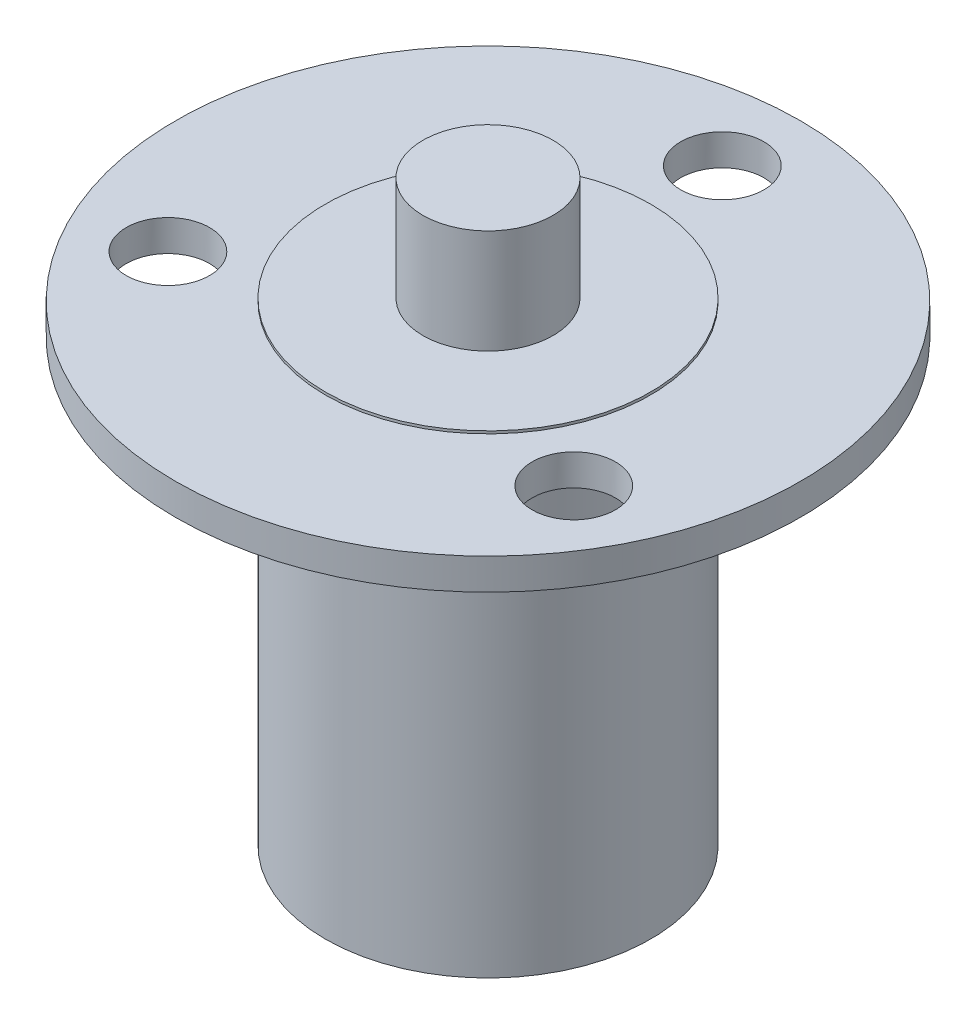
ISO-10303-21;
HEADER;
FILE_DESCRIPTION(('STEP AP214'),'2;1');
FILE_NAME('part.step','',(''),(''),'','','');
FILE_SCHEMA(('AUTOMOTIVE_DESIGN { 1 0 10303 214 1 1 1 1 }'));
ENDSEC;
DATA;
#1=APPLICATION_CONTEXT('core data for automotive mechanical design processes');
#2=APPLICATION_PROTOCOL_DEFINITION('international standard','automotive_design',2000,#1);
#3=PRODUCT_CONTEXT('',#1,'mechanical');
#4=PRODUCT('Part','Part','',(#3));
#5=PRODUCT_RELATED_PRODUCT_CATEGORY('part','',(#4));
#6=PRODUCT_DEFINITION_FORMATION('','',#4);
#7=PRODUCT_DEFINITION_CONTEXT('part definition',#1,'design');
#8=PRODUCT_DEFINITION('design','',#6,#7);
#9=PRODUCT_DEFINITION_SHAPE('','',#8);
#10=(LENGTH_UNIT() NAMED_UNIT(*) SI_UNIT(.MILLI.,.METRE.));
#11=(NAMED_UNIT(*) PLANE_ANGLE_UNIT() SI_UNIT($,.RADIAN.));
#12=(NAMED_UNIT(*) SI_UNIT($,.STERADIAN.) SOLID_ANGLE_UNIT());
#13=UNCERTAINTY_MEASURE_WITH_UNIT(LENGTH_MEASURE(1.E-05),#10,'distance_accuracy_value','');
#14=(GEOMETRIC_REPRESENTATION_CONTEXT(3) GLOBAL_UNCERTAINTY_ASSIGNED_CONTEXT((#13)) GLOBAL_UNIT_ASSIGNED_CONTEXT((#10,
#11,#12)) REPRESENTATION_CONTEXT('',''));
#15=CARTESIAN_POINT('',(0.,0.,0.));
#16=DIRECTION('',(0.,0.,1.));
#17=DIRECTION('',(1.,0.,0.));
#18=AXIS2_PLACEMENT_3D('',#15,#16,#17);
#19=CARTESIAN_POINT('',(0.,18.1,0.));
#20=DIRECTION('',(0.,-1.,0.));
#21=DIRECTION('',(0.,0.,-1.));
#22=AXIS2_PLACEMENT_3D('',#19,#20,#21);
#23=CYLINDRICAL_SURFACE('',#22,12.);
#24=CARTESIAN_POINT('',(0.,18.1,0.));
#25=DIRECTION('',(0.,-1.,0.));
#26=DIRECTION('',(0.,0.,-1.));
#27=AXIS2_PLACEMENT_3D('',#24,#25,#26);
#28=CIRCLE('',#27,12.);
#29=CARTESIAN_POINT('',(0.,18.1,-12.));
#30=VERTEX_POINT('',#29);
#31=EDGE_CURVE('E58',#30,#30,#28,.T.);
#32=ORIENTED_EDGE('',*,*,#31,.T.);
#33=EDGE_LOOP('',(#32));
#34=FACE_BOUND('',#33,.T.);
#35=CARTESIAN_POINT('',(0.,16.9,0.));
#36=DIRECTION('',(0.,-1.,0.));
#37=DIRECTION('',(0.,0.,-1.));
#38=AXIS2_PLACEMENT_3D('',#35,#36,#37);
#39=CIRCLE('',#38,12.);
#40=CARTESIAN_POINT('',(0.,16.9,-12.));
#41=VERTEX_POINT('',#40);
#42=EDGE_CURVE('E55',#41,#41,#39,.T.);
#43=ORIENTED_EDGE('',*,*,#42,.F.);
#44=EDGE_LOOP('',(#43));
#45=FACE_BOUND('',#44,.T.);
#46=ADVANCED_FACE('F31',(#34,#45),#23,.T.);
#47=CARTESIAN_POINT('',(12.,18.1,0.));
#48=DIRECTION('',(0.,1.,0.));
#49=DIRECTION('',(0.,0.,1.));
#50=AXIS2_PLACEMENT_3D('',#47,#48,#49);
#51=PLANE('',#50);
#52=CARTESIAN_POINT('',(-7.79422863405883,18.1,4.50000000000065));
#53=DIRECTION('',(0.,1.,0.));
#54=DIRECTION('',(0.,0.,1.));
#55=AXIS2_PLACEMENT_3D('',#52,#53,#54);
#56=CIRCLE('',#55,1.59999999999999);
#57=CARTESIAN_POINT('',(-7.79422863405883,18.1,6.10000000000063));
#58=VERTEX_POINT('',#57);
#59=EDGE_CURVE('E79',#58,#58,#56,.T.);
#60=ORIENTED_EDGE('',*,*,#59,.F.);
#61=EDGE_LOOP('',(#60));
#62=FACE_BOUND('',#61,.T.);
#63=CARTESIAN_POINT('',(7.79422863406107,18.1,4.49999999999935));
#64=DIRECTION('',(0.,1.,0.));
#65=DIRECTION('',(0.,0.,1.));
#66=AXIS2_PLACEMENT_3D('',#63,#64,#65);
#67=CIRCLE('',#66,1.59999999999999);
#68=CARTESIAN_POINT('',(7.79422863406107,18.1,6.09999999999934));
#69=VERTEX_POINT('',#68);
#70=EDGE_CURVE('E72',#69,#69,#67,.T.);
#71=ORIENTED_EDGE('',*,*,#70,.F.);
#72=EDGE_LOOP('',(#71));
#73=FACE_BOUND('',#72,.T.);
#74=CARTESIAN_POINT('',(0.,18.1,-9.));
#75=DIRECTION('',(0.,1.,0.));
#76=DIRECTION('',(0.,0.,1.));
#77=AXIS2_PLACEMENT_3D('',#74,#75,#76);
#78=CIRCLE('',#77,1.59999999999999);
#79=CARTESIAN_POINT('',(0.,18.1,-7.40000000000001));
#80=VERTEX_POINT('',#79);
#81=EDGE_CURVE('E64',#80,#80,#78,.T.);
#82=ORIENTED_EDGE('',*,*,#81,.F.);
#83=EDGE_LOOP('',(#82));
#84=FACE_BOUND('',#83,.T.);
#85=CARTESIAN_POINT('',(0.,18.1,0.));
#86=DIRECTION('',(0.,1.,0.));
#87=DIRECTION('',(0.,0.,1.));
#88=AXIS2_PLACEMENT_3D('',#85,#86,#87);
#89=CIRCLE('',#88,6.25);
#90=CARTESIAN_POINT('',(0.,18.1,6.25));
#91=VERTEX_POINT('',#90);
#92=EDGE_CURVE('E43',#91,#91,#89,.T.);
#93=ORIENTED_EDGE('',*,*,#92,.F.);
#94=EDGE_LOOP('',(#93));
#95=FACE_BOUND('',#94,.T.);
#96=ORIENTED_EDGE('',*,*,#31,.F.);
#97=EDGE_LOOP('',(#96));
#98=FACE_BOUND('',#97,.T.);
#99=ADVANCED_FACE('F85',(#62,#73,#84,#95,#98),#51,.T.);
#100=CARTESIAN_POINT('',(0.,16.9,0.));
#101=DIRECTION('',(0.,-1.,0.));
#102=DIRECTION('',(0.,0.,-1.));
#103=AXIS2_PLACEMENT_3D('',#100,#101,#102);
#104=PLANE('',#103);
#105=CARTESIAN_POINT('',(-7.79422863405883,16.9,4.50000000000065));
#106=DIRECTION('',(0.,-1.,0.));
#107=DIRECTION('',(0.,0.,-1.));
#108=AXIS2_PLACEMENT_3D('',#105,#106,#107);
#109=CIRCLE('',#108,1.59999999999998);
#110=CARTESIAN_POINT('',(-7.79422863405883,16.9,2.90000000000066));
#111=VERTEX_POINT('',#110);
#112=EDGE_CURVE('E76',#111,#111,#109,.T.);
#113=ORIENTED_EDGE('',*,*,#112,.F.);
#114=EDGE_LOOP('',(#113));
#115=FACE_BOUND('',#114,.T.);
#116=CARTESIAN_POINT('',(7.79422863406107,16.9,4.49999999999935));
#117=DIRECTION('',(0.,-1.,0.));
#118=DIRECTION('',(0.,0.,-1.));
#119=AXIS2_PLACEMENT_3D('',#116,#117,#118);
#120=CIRCLE('',#119,1.59999999999998);
#121=CARTESIAN_POINT('',(7.79422863406107,16.9,2.89999999999937));
#122=VERTEX_POINT('',#121);
#123=EDGE_CURVE('E34',#122,#122,#120,.T.);
#124=ORIENTED_EDGE('',*,*,#123,.F.);
#125=EDGE_LOOP('',(#124));
#126=FACE_BOUND('',#125,.T.);
#127=CARTESIAN_POINT('',(0.,16.9,-9.));
#128=DIRECTION('',(0.,-1.,0.));
#129=DIRECTION('',(0.,0.,-1.));
#130=AXIS2_PLACEMENT_3D('',#127,#128,#129);
#131=CIRCLE('',#130,1.59999999999998);
#132=CARTESIAN_POINT('',(0.,16.9,-10.6));
#133=VERTEX_POINT('',#132);
#134=EDGE_CURVE('E62',#133,#133,#131,.T.);
#135=ORIENTED_EDGE('',*,*,#134,.F.);
#136=EDGE_LOOP('',(#135));
#137=FACE_BOUND('',#136,.T.);
#138=CARTESIAN_POINT('',(0.,16.9,0.));
#139=DIRECTION('',(0.,-1.,0.));
#140=DIRECTION('',(0.,0.,-1.));
#141=AXIS2_PLACEMENT_3D('',#138,#139,#140);
#142=CIRCLE('',#141,6.25);
#143=CARTESIAN_POINT('',(0.,16.9,-6.25));
#144=VERTEX_POINT('',#143);
#145=EDGE_CURVE('E10',#144,#144,#142,.T.);
#146=ORIENTED_EDGE('',*,*,#145,.F.);
#147=EDGE_LOOP('',(#146));
#148=FACE_BOUND('',#147,.T.);
#149=ORIENTED_EDGE('',*,*,#42,.T.);
#150=EDGE_LOOP('',(#149));
#151=FACE_BOUND('',#150,.T.);
#152=ADVANCED_FACE('F88',(#115,#126,#137,#148,#151),#104,.T.);
#153=CARTESIAN_POINT('',(0.,18.2,0.));
#154=DIRECTION('',(0.,-1.,0.));
#155=DIRECTION('',(0.,0.,-1.));
#156=AXIS2_PLACEMENT_3D('',#153,#154,#155);
#157=CYLINDRICAL_SURFACE('',#156,6.25);
#158=CARTESIAN_POINT('',(0.,18.2,0.));
#159=DIRECTION('',(0.,1.,0.));
#160=DIRECTION('',(0.,0.,1.));
#161=AXIS2_PLACEMENT_3D('',#158,#159,#160);
#162=CIRCLE('',#161,6.25);
#163=CARTESIAN_POINT('',(0.,18.2,6.25));
#164=VERTEX_POINT('',#163);
#165=EDGE_CURVE('E51',#164,#164,#162,.T.);
#166=ORIENTED_EDGE('',*,*,#165,.F.);
#167=EDGE_LOOP('',(#166));
#168=FACE_BOUND('',#167,.T.);
#169=ORIENTED_EDGE('',*,*,#92,.T.);
#170=EDGE_LOOP('',(#169));
#171=FACE_BOUND('',#170,.T.);
#172=ADVANCED_FACE('F101',(#168,#171),#157,.T.);
#173=CARTESIAN_POINT('',(0.,18.2,0.));
#174=DIRECTION('',(0.,1.,0.));
#175=DIRECTION('',(0.,0.,1.));
#176=AXIS2_PLACEMENT_3D('',#173,#174,#175);
#177=PLANE('',#176);
#178=CARTESIAN_POINT('',(0.,18.2,0.));
#179=DIRECTION('',(0.,1.,0.));
#180=DIRECTION('',(0.,0.,1.));
#181=AXIS2_PLACEMENT_3D('',#178,#179,#180);
#182=CIRCLE('',#181,2.5);
#183=CARTESIAN_POINT('',(0.,18.2,2.5));
#184=VERTEX_POINT('',#183);
#185=EDGE_CURVE('E38',#184,#184,#182,.T.);
#186=ORIENTED_EDGE('',*,*,#185,.F.);
#187=EDGE_LOOP('',(#186));
#188=FACE_BOUND('',#187,.T.);
#189=ORIENTED_EDGE('',*,*,#165,.T.);
#190=EDGE_LOOP('',(#189));
#191=FACE_BOUND('',#190,.T.);
#192=ADVANCED_FACE('F107',(#188,#191),#177,.T.);
#193=CARTESIAN_POINT('',(0.,22.2,0.));
#194=DIRECTION('',(0.,-1.,0.));
#195=DIRECTION('',(0.,0.,-1.));
#196=AXIS2_PLACEMENT_3D('',#193,#194,#195);
#197=CYLINDRICAL_SURFACE('',#196,2.5);
#198=CARTESIAN_POINT('',(0.,22.2,0.));
#199=DIRECTION('',(0.,1.,0.));
#200=DIRECTION('',(0.,0.,1.));
#201=AXIS2_PLACEMENT_3D('',#198,#199,#200);
#202=CIRCLE('',#201,2.5);
#203=CARTESIAN_POINT('',(0.,22.2,2.5));
#204=VERTEX_POINT('',#203);
#205=EDGE_CURVE('E49',#204,#204,#202,.T.);
#206=ORIENTED_EDGE('',*,*,#205,.F.);
#207=EDGE_LOOP('',(#206));
#208=FACE_BOUND('',#207,.T.);
#209=ORIENTED_EDGE('',*,*,#185,.T.);
#210=EDGE_LOOP('',(#209));
#211=FACE_BOUND('',#210,.T.);
#212=ADVANCED_FACE('F115',(#208,#211),#197,.T.);
#213=CARTESIAN_POINT('',(0.,22.2,0.));
#214=DIRECTION('',(0.,1.,0.));
#215=DIRECTION('',(0.,0.,1.));
#216=AXIS2_PLACEMENT_3D('',#213,#214,#215);
#217=PLANE('',#216);
#218=ORIENTED_EDGE('',*,*,#205,.T.);
#219=EDGE_LOOP('',(#218));
#220=FACE_BOUND('',#219,.T.);
#221=ADVANCED_FACE('F119',(#220),#217,.T.);
#222=CARTESIAN_POINT('',(0.,0.,0.));
#223=DIRECTION('',(0.,1.,0.));
#224=DIRECTION('',(0.,0.,1.));
#225=AXIS2_PLACEMENT_3D('',#222,#223,#224);
#226=CYLINDRICAL_SURFACE('',#225,6.25);
#227=CARTESIAN_POINT('',(0.,0.,0.));
#228=DIRECTION('',(0.,-1.,0.));
#229=DIRECTION('',(0.,0.,-1.));
#230=AXIS2_PLACEMENT_3D('',#227,#228,#229);
#231=CIRCLE('',#230,6.25);
#232=CARTESIAN_POINT('',(0.,0.,-6.25));
#233=VERTEX_POINT('',#232);
#234=EDGE_CURVE('E47',#233,#233,#231,.T.);
#235=ORIENTED_EDGE('',*,*,#234,.F.);
#236=EDGE_LOOP('',(#235));
#237=FACE_BOUND('',#236,.T.);
#238=ORIENTED_EDGE('',*,*,#145,.T.);
#239=EDGE_LOOP('',(#238));
#240=FACE_BOUND('',#239,.T.);
#241=ADVANCED_FACE('F123',(#237,#240),#226,.T.);
#242=CARTESIAN_POINT('',(0.,0.,0.));
#243=DIRECTION('',(0.,-1.,0.));
#244=DIRECTION('',(0.,0.,-1.));
#245=AXIS2_PLACEMENT_3D('',#242,#243,#244);
#246=PLANE('',#245);
#247=ORIENTED_EDGE('',*,*,#234,.T.);
#248=EDGE_LOOP('',(#247));
#249=FACE_BOUND('',#248,.T.);
#250=ADVANCED_FACE('F127',(#249),#246,.T.);
#251=CARTESIAN_POINT('',(0.,18.1,-9.));
#252=DIRECTION('',(0.,1.,0.));
#253=DIRECTION('',(0.,0.,1.));
#254=AXIS2_PLACEMENT_3D('',#251,#252,#253);
#255=CYLINDRICAL_SURFACE('',#254,1.59999999999998);
#256=ORIENTED_EDGE('',*,*,#134,.T.);
#257=EDGE_LOOP('',(#256));
#258=FACE_BOUND('',#257,.T.);
#259=ORIENTED_EDGE('',*,*,#81,.T.);
#260=EDGE_LOOP('',(#259));
#261=FACE_BOUND('',#260,.T.);
#262=ADVANCED_FACE('F131',(#258,#261),#255,.F.);
#263=CARTESIAN_POINT('',(7.79422863406107,18.1,4.49999999999935));
#264=DIRECTION('',(0.,1.,0.));
#265=DIRECTION('',(0.,0.,1.));
#266=AXIS2_PLACEMENT_3D('',#263,#264,#265);
#267=CYLINDRICAL_SURFACE('',#266,1.59999999999998);
#268=ORIENTED_EDGE('',*,*,#123,.T.);
#269=EDGE_LOOP('',(#268));
#270=FACE_BOUND('',#269,.T.);
#271=ORIENTED_EDGE('',*,*,#70,.T.);
#272=EDGE_LOOP('',(#271));
#273=FACE_BOUND('',#272,.T.);
#274=ADVANCED_FACE('F135',(#270,#273),#267,.F.);
#275=CARTESIAN_POINT('',(-7.79422863405883,18.1,4.50000000000065));
#276=DIRECTION('',(0.,1.,0.));
#277=DIRECTION('',(0.,0.,1.));
#278=AXIS2_PLACEMENT_3D('',#275,#276,#277);
#279=CYLINDRICAL_SURFACE('',#278,1.59999999999998);
#280=ORIENTED_EDGE('',*,*,#112,.T.);
#281=EDGE_LOOP('',(#280));
#282=FACE_BOUND('',#281,.T.);
#283=ORIENTED_EDGE('',*,*,#59,.T.);
#284=EDGE_LOOP('',(#283));
#285=FACE_BOUND('',#284,.T.);
#286=ADVANCED_FACE('F83',(#282,#285),#279,.F.);
#287=CLOSED_SHELL('',(#46,#99,#152,#172,#192,#212,#221,#241,#250,#262,#274,#286));
#288=MANIFOLD_SOLID_BREP('B2',#287);
#289=ADVANCED_BREP_SHAPE_REPRESENTATION('',(#18,#288),#14);
#290=SHAPE_DEFINITION_REPRESENTATION(#9,#289);
ENDSEC;
END-ISO-10303-21;
